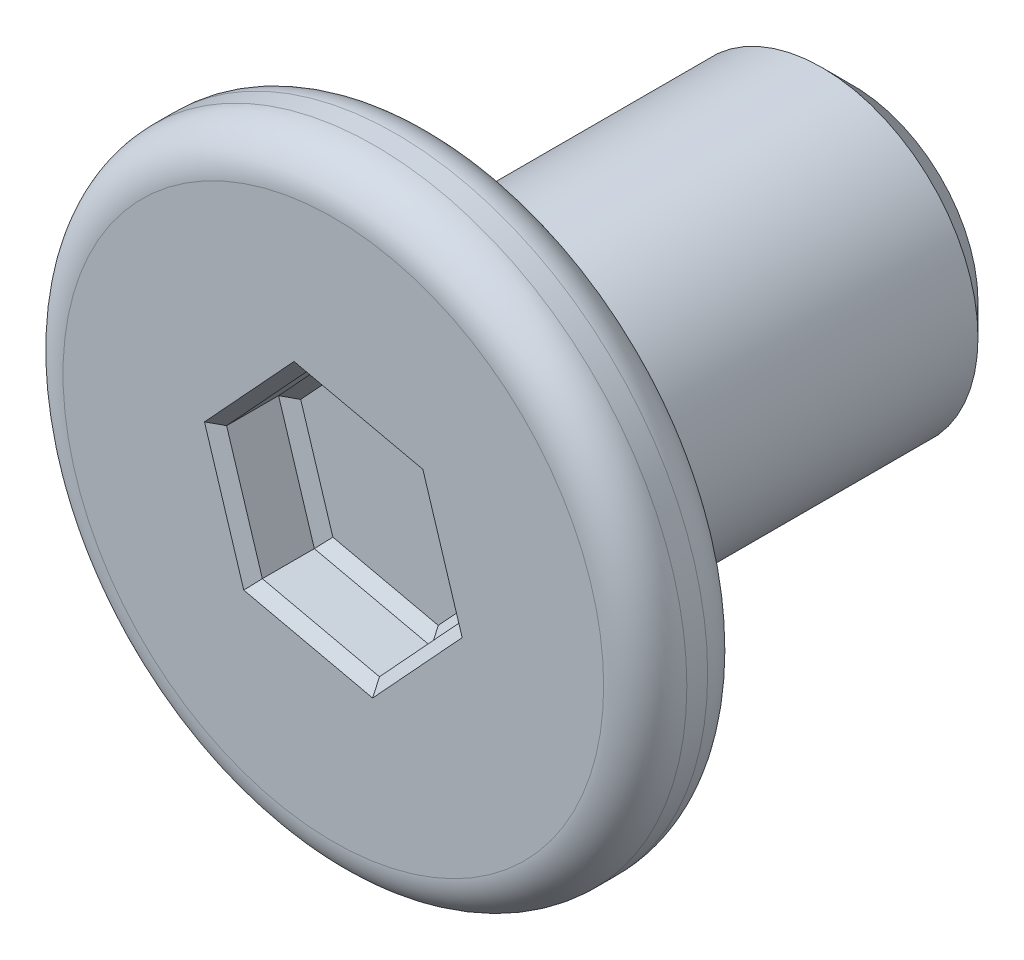
ISO-10303-21;
HEADER;
FILE_DESCRIPTION(('STEP AP214'),'2;1');
FILE_NAME('part.step','',(''),(''),'','','');
FILE_SCHEMA(('AUTOMOTIVE_DESIGN { 1 0 10303 214 1 1 1 1 }'));
ENDSEC;
DATA;
#1=APPLICATION_CONTEXT('core data for automotive mechanical design processes');
#2=APPLICATION_PROTOCOL_DEFINITION('international standard','automotive_design',2000,#1);
#3=PRODUCT_CONTEXT('',#1,'mechanical');
#4=PRODUCT('Part','Part','',(#3));
#5=PRODUCT_RELATED_PRODUCT_CATEGORY('part','',(#4));
#6=PRODUCT_DEFINITION_FORMATION('','',#4);
#7=PRODUCT_DEFINITION_CONTEXT('part definition',#1,'design');
#8=PRODUCT_DEFINITION('design','',#6,#7);
#9=PRODUCT_DEFINITION_SHAPE('','',#8);
#10=(LENGTH_UNIT() NAMED_UNIT(*) SI_UNIT(.MILLI.,.METRE.));
#11=(NAMED_UNIT(*) PLANE_ANGLE_UNIT() SI_UNIT($,.RADIAN.));
#12=(NAMED_UNIT(*) SI_UNIT($,.STERADIAN.) SOLID_ANGLE_UNIT());
#13=UNCERTAINTY_MEASURE_WITH_UNIT(LENGTH_MEASURE(1.E-05),#10,'distance_accuracy_value','');
#14=(GEOMETRIC_REPRESENTATION_CONTEXT(3) GLOBAL_UNCERTAINTY_ASSIGNED_CONTEXT((#13)) GLOBAL_UNIT_ASSIGNED_CONTEXT((#10,
#11,#12)) REPRESENTATION_CONTEXT('',''));
#15=CARTESIAN_POINT('',(0.,0.,0.));
#16=DIRECTION('',(0.,0.,1.));
#17=DIRECTION('',(1.,0.,0.));
#18=AXIS2_PLACEMENT_3D('',#15,#16,#17);
#19=CARTESIAN_POINT('',(0.,0.,1.));
#20=DIRECTION('',(0.,0.,-1.));
#21=DIRECTION('',(-1.,0.,0.));
#22=AXIS2_PLACEMENT_3D('',#19,#20,#21);
#23=CYLINDRICAL_SURFACE('',#22,3.);
#24=CARTESIAN_POINT('',(0.,0.,0.4));
#25=DIRECTION('',(0.,0.,1.));
#26=DIRECTION('',(1.,0.,0.));
#27=AXIS2_PLACEMENT_3D('',#24,#25,#26);
#28=CIRCLE('',#27,3.);
#29=CARTESIAN_POINT('',(3.,0.,0.4));
#30=VERTEX_POINT('',#29);
#31=EDGE_CURVE('E284',#30,#30,#28,.T.);
#32=ORIENTED_EDGE('',*,*,#31,.T.);
#33=EDGE_LOOP('',(#32));
#34=FACE_BOUND('',#33,.T.);
#35=CARTESIAN_POINT('',(0.,0.,0.6));
#36=DIRECTION('',(0.,0.,1.));
#37=DIRECTION('',(1.,0.,0.));
#38=AXIS2_PLACEMENT_3D('',#35,#36,#37);
#39=CIRCLE('',#38,3.);
#40=CARTESIAN_POINT('',(3.,0.,0.6));
#41=VERTEX_POINT('',#40);
#42=EDGE_CURVE('E281',#41,#41,#39,.F.);
#43=ORIENTED_EDGE('',*,*,#42,.T.);
#44=EDGE_LOOP('',(#43));
#45=FACE_BOUND('',#44,.T.);
#46=ADVANCED_FACE('F36',(#34,#45),#23,.T.);
#47=CARTESIAN_POINT('',(0.,0.,1.));
#48=DIRECTION('',(0.,0.,1.));
#49=DIRECTION('',(1.,0.,0.));
#50=AXIS2_PLACEMENT_3D('',#47,#48,#49);
#51=PLANE('',#50);
#52=DIRECTION('',(-0.67799733144157,-0.735064363547921,0.));
#53=VECTOR('',#52,1.);
#54=CARTESIAN_POINT('',(0.417128858085074,-1.17018667275182,1.));
#55=LINE('',#54,#53);
#56=CARTESIAN_POINT('',(1.23915693590211,-0.278968495603025,1.));
#57=VERTEX_POINT('',#56);
#58=CARTESIAN_POINT('',(0.37798466390331,-1.21262563356843,1.));
#59=VERTEX_POINT('',#58);
#60=EDGE_CURVE('E220',#57,#59,#55,.T.);
#61=ORIENTED_EDGE('',*,*,#60,.T.);
#62=DIRECTION('',(-0.975583077969925,0.219630730952497,0.));
#63=VECTOR('',#62,1.);
#64=CARTESIAN_POINT('',(-0.804846956730526,-0.946337524129178,1.));
#65=LINE('',#64,#63);
#66=CARTESIAN_POINT('',(-0.861172271998804,-0.933657137965404,1.));
#67=VERTEX_POINT('',#66);
#68=EDGE_CURVE('E225',#59,#67,#65,.T.);
#69=ORIENTED_EDGE('',*,*,#68,.T.);
#70=DIRECTION('',(-0.297585746528355,0.954695094500418,0.));
#71=VECTOR('',#70,1.);
#72=CARTESIAN_POINT('',(-1.2219758148156,0.223849148622641,1.));
#73=LINE('',#72,#71);
#74=CARTESIAN_POINT('',(-1.23915693590211,0.278968495603024,1.));
#75=VERTEX_POINT('',#74);
#76=EDGE_CURVE('E218',#67,#75,#73,.T.);
#77=ORIENTED_EDGE('',*,*,#76,.T.);
#78=DIRECTION('',(0.67799733144157,0.735064363547921,0.));
#79=VECTOR('',#78,1.);
#80=CARTESIAN_POINT('',(-0.417128858085074,1.17018667275182,1.));
#81=LINE('',#80,#79);
#82=CARTESIAN_POINT('',(-0.377984663903311,1.21262563356843,1.));
#83=VERTEX_POINT('',#82);
#84=EDGE_CURVE('E207',#75,#83,#81,.T.);
#85=ORIENTED_EDGE('',*,*,#84,.T.);
#86=DIRECTION('',(0.975583077969925,-0.219630730952497,0.));
#87=VECTOR('',#86,1.);
#88=CARTESIAN_POINT('',(0.804846956730525,0.946337524129178,1.));
#89=LINE('',#88,#87);
#90=CARTESIAN_POINT('',(0.861172271998803,0.933657137965404,1.));
#91=VERTEX_POINT('',#90);
#92=EDGE_CURVE('E214',#83,#91,#89,.T.);
#93=ORIENTED_EDGE('',*,*,#92,.T.);
#94=DIRECTION('',(0.297585746528355,-0.954695094500418,0.));
#95=VECTOR('',#94,1.);
#96=CARTESIAN_POINT('',(1.2219758148156,-0.223849148622642,1.));
#97=LINE('',#96,#95);
#98=EDGE_CURVE('E216',#91,#57,#97,.T.);
#99=ORIENTED_EDGE('',*,*,#98,.T.);
#100=EDGE_LOOP('',(#61,#69,#77,#85,#93,#99));
#101=FACE_BOUND('',#100,.T.);
#102=CARTESIAN_POINT('',(0.,0.,1.));
#103=DIRECTION('',(0.,0.,1.));
#104=DIRECTION('',(1.,0.,0.));
#105=AXIS2_PLACEMENT_3D('',#102,#103,#104);
#106=CIRCLE('',#105,2.6);
#107=CARTESIAN_POINT('',(2.6,0.,1.));
#108=VERTEX_POINT('',#107);
#109=EDGE_CURVE('E158',#108,#108,#106,.T.);
#110=ORIENTED_EDGE('',*,*,#109,.T.);
#111=EDGE_LOOP('',(#110));
#112=FACE_BOUND('',#111,.T.);
#113=ADVANCED_FACE('F294',(#101,#112),#51,.T.);
#114=CARTESIAN_POINT('',(0.,0.,0.));
#115=DIRECTION('',(0.,0.,1.));
#116=DIRECTION('',(1.,0.,0.));
#117=AXIS2_PLACEMENT_3D('',#114,#115,#116);
#118=PLANE('',#117);
#119=CARTESIAN_POINT('',(0.,0.,0.));
#120=DIRECTION('',(0.,0.,1.));
#121=DIRECTION('',(1.,0.,0.));
#122=AXIS2_PLACEMENT_3D('',#119,#120,#121);
#123=CIRCLE('',#122,2.6);
#124=CARTESIAN_POINT('',(2.6,0.,0.));
#125=VERTEX_POINT('',#124);
#126=EDGE_CURVE('E287',#125,#125,#123,.F.);
#127=ORIENTED_EDGE('',*,*,#126,.T.);
#128=EDGE_LOOP('',(#127));
#129=FACE_BOUND('',#128,.T.);
#130=CARTESIAN_POINT('',(0.,0.,0.));
#131=DIRECTION('',(0.,0.,-1.));
#132=DIRECTION('',(-1.,0.,0.));
#133=AXIS2_PLACEMENT_3D('',#130,#131,#132);
#134=CIRCLE('',#133,1.5);
#135=CARTESIAN_POINT('',(-1.5,0.,0.));
#136=VERTEX_POINT('',#135);
#137=EDGE_CURVE('E271',#136,#136,#134,.T.);
#138=ORIENTED_EDGE('',*,*,#137,.F.);
#139=EDGE_LOOP('',(#138));
#140=FACE_BOUND('',#139,.T.);
#141=ADVANCED_FACE('F326',(#129,#140),#118,.F.);
#142=CARTESIAN_POINT('',(0.,0.,-4.));
#143=DIRECTION('',(0.,0.,1.));
#144=DIRECTION('',(1.,0.,0.));
#145=AXIS2_PLACEMENT_3D('',#142,#143,#144);
#146=CYLINDRICAL_SURFACE('',#145,1.5);
#147=CARTESIAN_POINT('',(0.,0.,-3.7));
#148=DIRECTION('',(0.,0.,-1.));
#149=DIRECTION('',(-1.,0.,0.));
#150=AXIS2_PLACEMENT_3D('',#147,#148,#149);
#151=CIRCLE('',#150,1.5);
#152=CARTESIAN_POINT('',(-1.5,0.,-3.7));
#153=VERTEX_POINT('',#152);
#154=EDGE_CURVE('E11',#153,#153,#151,.F.);
#155=ORIENTED_EDGE('',*,*,#154,.T.);
#156=EDGE_LOOP('',(#155));
#157=FACE_BOUND('',#156,.T.);
#158=ORIENTED_EDGE('',*,*,#137,.T.);
#159=EDGE_LOOP('',(#158));
#160=FACE_BOUND('',#159,.T.);
#161=ADVANCED_FACE('F403',(#157,#160),#146,.T.);
#162=CARTESIAN_POINT('',(0.,0.,-4.));
#163=DIRECTION('',(0.,0.,-1.));
#164=DIRECTION('',(-1.,0.,0.));
#165=AXIS2_PLACEMENT_3D('',#162,#163,#164);
#166=PLANE('',#165);
#167=CARTESIAN_POINT('',(0.,0.,-4.));
#168=DIRECTION('',(0.,0.,-1.));
#169=DIRECTION('',(-1.,0.,0.));
#170=AXIS2_PLACEMENT_3D('',#167,#168,#169);
#171=CIRCLE('',#170,1.2);
#172=CARTESIAN_POINT('',(-1.2,0.,-4.));
#173=VERTEX_POINT('',#172);
#174=EDGE_CURVE('E44',#173,#173,#171,.T.);
#175=ORIENTED_EDGE('',*,*,#174,.T.);
#176=EDGE_LOOP('',(#175));
#177=FACE_BOUND('',#176,.T.);
#178=ADVANCED_FACE('F335',(#177),#166,.T.);
#179=CARTESIAN_POINT('',(0.,0.,0.4));
#180=DIRECTION('',(0.,0.,1.));
#181=DIRECTION('',(1.,0.,0.));
#182=AXIS2_PLACEMENT_3D('',#179,#180,#181);
#183=TOROIDAL_SURFACE('',#182,2.6,0.4);
#184=ORIENTED_EDGE('',*,*,#126,.F.);
#185=EDGE_LOOP('',(#184));
#186=FACE_BOUND('',#185,.T.);
#187=ORIENTED_EDGE('',*,*,#31,.F.);
#188=EDGE_LOOP('',(#187));
#189=FACE_BOUND('',#188,.T.);
#190=ADVANCED_FACE('F331',(#186,#189),#183,.T.);
#191=CARTESIAN_POINT('',(0.,0.,0.6));
#192=DIRECTION('',(0.,0.,1.));
#193=DIRECTION('',(1.,0.,0.));
#194=AXIS2_PLACEMENT_3D('',#191,#192,#193);
#195=TOROIDAL_SURFACE('',#194,2.6,0.4);
#196=ORIENTED_EDGE('',*,*,#42,.F.);
#197=EDGE_LOOP('',(#196));
#198=FACE_BOUND('',#197,.T.);
#199=ORIENTED_EDGE('',*,*,#109,.F.);
#200=EDGE_LOOP('',(#199));
#201=FACE_BOUND('',#200,.T.);
#202=ADVANCED_FACE('F334',(#198,#201),#195,.T.);
#203=CARTESIAN_POINT('',(-0.782883883635277,-0.848779216332186,0.3));
#204=DIRECTION('',(-0.219630730952497,-0.975583077969925,0.));
#205=DIRECTION('',(0.975583077969925,-0.219630730952497,0.));
#206=AXIS2_PLACEMENT_3D('',#203,#204,#205);
#207=PLANE('',#206);
#208=DIRECTION('',(0.,0.,1.));
#209=VECTOR('',#208,1.);
#210=CARTESIAN_POINT('',(-0.782883883635277,-0.848779216332186,0.3));
#211=LINE('',#210,#209);
#212=CARTESIAN_POINT('',(-0.782883883635277,-0.848779216332186,0.4));
#213=VERTEX_POINT('',#212);
#214=CARTESIAN_POINT('',(-0.782883883635277,-0.848779216332186,0.900000000000001));
#215=VERTEX_POINT('',#214);
#216=EDGE_CURVE('E264',#213,#215,#211,.T.);
#217=ORIENTED_EDGE('',*,*,#216,.T.);
#218=DIRECTION('',(0.975583077969925,-0.219630730952497,0.));
#219=VECTOR('',#218,1.);
#220=CARTESIAN_POINT('',(0.343622421730282,-1.10238693960766,0.900000000000001));
#221=LINE('',#220,#219);
#222=CARTESIAN_POINT('',(0.343622421730282,-1.10238693960766,0.900000000000001));
#223=VERTEX_POINT('',#222);
#224=EDGE_CURVE('E148',#215,#223,#221,.T.);
#225=ORIENTED_EDGE('',*,*,#224,.T.);
#226=DIRECTION('',(0.,0.,1.));
#227=VECTOR('',#226,1.);
#228=CARTESIAN_POINT('',(0.343622421730282,-1.10238693960766,0.3));
#229=LINE('',#228,#227);
#230=CARTESIAN_POINT('',(0.343622421730282,-1.10238693960766,0.4));
#231=VERTEX_POINT('',#230);
#232=EDGE_CURVE('E129',#231,#223,#229,.T.);
#233=ORIENTED_EDGE('',*,*,#232,.F.);
#234=DIRECTION('',(-0.975583077969925,0.219630730952497,0.));
#235=VECTOR('',#234,1.);
#236=CARTESIAN_POINT('',(-0.782883883635277,-0.848779216332186,0.4));
#237=LINE('',#236,#235);
#238=EDGE_CURVE('E145',#231,#213,#237,.T.);
#239=ORIENTED_EDGE('',*,*,#238,.T.);
#240=EDGE_LOOP('',(#217,#225,#233,#239));
#241=FACE_BOUND('',#240,.T.);
#242=ADVANCED_FACE('F144',(#241),#207,.F.);
#243=CARTESIAN_POINT('',(-1.12650630536556,0.253607723275477,0.3));
#244=DIRECTION('',(-0.954695094500418,-0.297585746528355,0.));
#245=DIRECTION('',(0.297585746528355,-0.954695094500418,0.));
#246=AXIS2_PLACEMENT_3D('',#243,#244,#245);
#247=PLANE('',#246);
#248=DIRECTION('',(0.,0.,1.));
#249=VECTOR('',#248,1.);
#250=CARTESIAN_POINT('',(-1.12650630536556,0.253607723275477,0.3));
#251=LINE('',#250,#249);
#252=CARTESIAN_POINT('',(-1.12650630536556,0.253607723275477,0.4));
#253=VERTEX_POINT('',#252);
#254=CARTESIAN_POINT('',(-1.12650630536556,0.253607723275477,0.900000000000001));
#255=VERTEX_POINT('',#254);
#256=EDGE_CURVE('E263',#253,#255,#251,.T.);
#257=ORIENTED_EDGE('',*,*,#256,.T.);
#258=DIRECTION('',(0.297585746528355,-0.954695094500418,0.));
#259=VECTOR('',#258,1.);
#260=CARTESIAN_POINT('',(-0.782883883635277,-0.848779216332186,0.900000000000001));
#261=LINE('',#260,#259);
#262=EDGE_CURVE('E230',#255,#215,#261,.T.);
#263=ORIENTED_EDGE('',*,*,#262,.T.);
#264=ORIENTED_EDGE('',*,*,#216,.F.);
#265=DIRECTION('',(-0.297585746528355,0.954695094500418,0.));
#266=VECTOR('',#265,1.);
#267=CARTESIAN_POINT('',(-1.12650630536556,0.253607723275477,0.4));
#268=LINE('',#267,#266);
#269=EDGE_CURVE('E228',#213,#253,#268,.T.);
#270=ORIENTED_EDGE('',*,*,#269,.T.);
#271=EDGE_LOOP('',(#257,#263,#264,#270));
#272=FACE_BOUND('',#271,.T.);
#273=ADVANCED_FACE('F262',(#272),#247,.F.);
#274=CARTESIAN_POINT('',(-0.343622421730283,1.10238693960766,0.3));
#275=DIRECTION('',(-0.735064363547921,0.67799733144157,0.));
#276=DIRECTION('',(-0.67799733144157,-0.735064363547921,0.));
#277=AXIS2_PLACEMENT_3D('',#274,#275,#276);
#278=PLANE('',#277);
#279=DIRECTION('',(0.,0.,1.));
#280=VECTOR('',#279,1.);
#281=CARTESIAN_POINT('',(-0.343622421730283,1.10238693960766,0.3));
#282=LINE('',#281,#280);
#283=CARTESIAN_POINT('',(-0.343622421730283,1.10238693960766,0.4));
#284=VERTEX_POINT('',#283);
#285=CARTESIAN_POINT('',(-0.343622421730283,1.10238693960766,0.900000000000001));
#286=VERTEX_POINT('',#285);
#287=EDGE_CURVE('E269',#284,#286,#282,.T.);
#288=ORIENTED_EDGE('',*,*,#287,.T.);
#289=DIRECTION('',(-0.67799733144157,-0.735064363547921,0.));
#290=VECTOR('',#289,1.);
#291=CARTESIAN_POINT('',(-1.12650630536556,0.253607723275477,0.900000000000001));
#292=LINE('',#291,#290);
#293=EDGE_CURVE('E208',#286,#255,#292,.T.);
#294=ORIENTED_EDGE('',*,*,#293,.T.);
#295=ORIENTED_EDGE('',*,*,#256,.F.);
#296=DIRECTION('',(0.67799733144157,0.735064363547921,0.));
#297=VECTOR('',#296,1.);
#298=CARTESIAN_POINT('',(-0.343622421730283,1.10238693960766,0.4));
#299=LINE('',#298,#297);
#300=EDGE_CURVE('E232',#253,#284,#299,.T.);
#301=ORIENTED_EDGE('',*,*,#300,.T.);
#302=EDGE_LOOP('',(#288,#294,#295,#301));
#303=FACE_BOUND('',#302,.T.);
#304=ADVANCED_FACE('F267',(#303),#278,.F.);
#305=CARTESIAN_POINT('',(0.782883883635276,0.848779216332186,0.3));
#306=DIRECTION('',(0.219630730952497,0.975583077969925,0.));
#307=DIRECTION('',(-0.975583077969925,0.219630730952497,0.));
#308=AXIS2_PLACEMENT_3D('',#305,#306,#307);
#309=PLANE('',#308);
#310=DIRECTION('',(0.,0.,1.));
#311=VECTOR('',#310,1.);
#312=CARTESIAN_POINT('',(0.782883883635276,0.848779216332186,0.3));
#313=LINE('',#312,#311);
#314=CARTESIAN_POINT('',(0.782883883635276,0.848779216332186,0.4));
#315=VERTEX_POINT('',#314);
#316=CARTESIAN_POINT('',(0.782883883635276,0.848779216332186,0.9));
#317=VERTEX_POINT('',#316);
#318=EDGE_CURVE('E273',#315,#317,#313,.T.);
#319=ORIENTED_EDGE('',*,*,#318,.T.);
#320=DIRECTION('',(-0.975583077969925,0.219630730952497,0.));
#321=VECTOR('',#320,1.);
#322=CARTESIAN_POINT('',(-0.343622421730283,1.10238693960766,0.900000000000001));
#323=LINE('',#322,#321);
#324=EDGE_CURVE('E213',#317,#286,#323,.T.);
#325=ORIENTED_EDGE('',*,*,#324,.T.);
#326=ORIENTED_EDGE('',*,*,#287,.F.);
#327=DIRECTION('',(0.975583077969925,-0.219630730952497,0.));
#328=VECTOR('',#327,1.);
#329=CARTESIAN_POINT('',(0.782883883635276,0.848779216332186,0.4));
#330=LINE('',#329,#328);
#331=EDGE_CURVE('E235',#284,#315,#330,.T.);
#332=ORIENTED_EDGE('',*,*,#331,.T.);
#333=EDGE_LOOP('',(#319,#325,#326,#332));
#334=FACE_BOUND('',#333,.T.);
#335=ADVANCED_FACE('F455',(#334),#309,.F.);
#336=CARTESIAN_POINT('',(1.12650630536556,-0.253607723275477,0.3));
#337=DIRECTION('',(0.954695094500418,0.297585746528355,0.));
#338=DIRECTION('',(-0.297585746528355,0.954695094500418,0.));
#339=AXIS2_PLACEMENT_3D('',#336,#337,#338);
#340=PLANE('',#339);
#341=DIRECTION('',(0.,0.,1.));
#342=VECTOR('',#341,1.);
#343=CARTESIAN_POINT('',(1.12650630536556,-0.253607723275477,0.3));
#344=LINE('',#343,#342);
#345=CARTESIAN_POINT('',(1.12650630536556,-0.253607723275477,0.4));
#346=VERTEX_POINT('',#345);
#347=CARTESIAN_POINT('',(1.12650630536556,-0.253607723275477,0.900000000000001));
#348=VERTEX_POINT('',#347);
#349=EDGE_CURVE('E131',#346,#348,#344,.T.);
#350=ORIENTED_EDGE('',*,*,#349,.T.);
#351=DIRECTION('',(-0.297585746528355,0.954695094500418,0.));
#352=VECTOR('',#351,1.);
#353=CARTESIAN_POINT('',(0.782883883635276,0.848779216332186,0.9));
#354=LINE('',#353,#352);
#355=EDGE_CURVE('E137',#348,#317,#354,.T.);
#356=ORIENTED_EDGE('',*,*,#355,.T.);
#357=ORIENTED_EDGE('',*,*,#318,.F.);
#358=DIRECTION('',(0.297585746528355,-0.954695094500418,0.));
#359=VECTOR('',#358,1.);
#360=CARTESIAN_POINT('',(1.12650630536556,-0.253607723275477,0.4));
#361=LINE('',#360,#359);
#362=EDGE_CURVE('E238',#315,#346,#361,.T.);
#363=ORIENTED_EDGE('',*,*,#362,.T.);
#364=EDGE_LOOP('',(#350,#356,#357,#363));
#365=FACE_BOUND('',#364,.T.);
#366=ADVANCED_FACE('F306',(#365),#340,.F.);
#367=CARTESIAN_POINT('',(0.343622421730282,-1.10238693960766,0.3));
#368=DIRECTION('',(0.735064363547921,-0.67799733144157,0.));
#369=DIRECTION('',(0.67799733144157,0.735064363547921,0.));
#370=AXIS2_PLACEMENT_3D('',#367,#368,#369);
#371=PLANE('',#370);
#372=ORIENTED_EDGE('',*,*,#232,.T.);
#373=DIRECTION('',(0.67799733144157,0.735064363547921,0.));
#374=VECTOR('',#373,1.);
#375=CARTESIAN_POINT('',(1.12650630536556,-0.253607723275477,0.900000000000001));
#376=LINE('',#375,#374);
#377=EDGE_CURVE('E136',#223,#348,#376,.T.);
#378=ORIENTED_EDGE('',*,*,#377,.T.);
#379=ORIENTED_EDGE('',*,*,#349,.F.);
#380=DIRECTION('',(-0.67799733144157,-0.735064363547921,0.));
#381=VECTOR('',#380,1.);
#382=CARTESIAN_POINT('',(0.343622421730282,-1.10238693960766,0.4));
#383=LINE('',#382,#381);
#384=EDGE_CURVE('E126',#346,#231,#383,.T.);
#385=ORIENTED_EDGE('',*,*,#384,.T.);
#386=EDGE_LOOP('',(#372,#378,#379,#385));
#387=FACE_BOUND('',#386,.T.);
#388=ADVANCED_FACE('F128',(#387),#371,.F.);
#389=CARTESIAN_POINT('',(0.,0.,0.3));
#390=DIRECTION('',(0.,0.,1.));
#391=DIRECTION('',(1.,0.,0.));
#392=AXIS2_PLACEMENT_3D('',#389,#390,#391);
#393=PLANE('',#392);
#394=DIRECTION('',(0.297585746528355,-0.954695094500418,0.));
#395=VECTOR('',#394,1.);
#396=CARTESIAN_POINT('',(-0.859225585050374,-0.267827171875519,0.3));
#397=LINE('',#396,#395);
#398=CARTESIAN_POINT('',(-1.013855674829,0.228246950947929,0.3));
#399=VERTEX_POINT('',#398);
#400=CARTESIAN_POINT('',(-0.704595495271748,-0.763901294698966,0.3));
#401=VERTEX_POINT('',#400);
#402=EDGE_CURVE('E51',#399,#401,#397,.T.);
#403=ORIENTED_EDGE('',*,*,#402,.T.);
#404=DIRECTION('',(0.975583077969925,-0.219630730952497,0.));
#405=VECTOR('',#404,1.);
#406=CARTESIAN_POINT('',(-0.197667657857247,-0.878024770172931,0.3));
#407=LINE('',#406,#405);
#408=CARTESIAN_POINT('',(0.309260179557253,-0.992148245646895,0.3));
#409=VERTEX_POINT('',#408);
#410=EDGE_CURVE('E179',#401,#409,#407,.T.);
#411=ORIENTED_EDGE('',*,*,#410,.T.);
#412=DIRECTION('',(0.67799733144157,0.735064363547921,0.));
#413=VECTOR('',#412,1.);
#414=CARTESIAN_POINT('',(0.661557927193127,-0.610197598297412,0.3));
#415=LINE('',#414,#413);
#416=CARTESIAN_POINT('',(1.013855674829,-0.228246950947929,0.3));
#417=VERTEX_POINT('',#416);
#418=EDGE_CURVE('E161',#409,#417,#415,.T.);
#419=ORIENTED_EDGE('',*,*,#418,.T.);
#420=DIRECTION('',(-0.297585746528355,0.954695094500418,0.));
#421=VECTOR('',#420,1.);
#422=CARTESIAN_POINT('',(0.859225585050374,0.267827171875519,0.3));
#423=LINE('',#422,#421);
#424=CARTESIAN_POINT('',(0.704595495271747,0.763901294698967,0.3));
#425=VERTEX_POINT('',#424);
#426=EDGE_CURVE('E243',#417,#425,#423,.T.);
#427=ORIENTED_EDGE('',*,*,#426,.T.);
#428=DIRECTION('',(-0.975583077969925,0.219630730952497,0.));
#429=VECTOR('',#428,1.);
#430=CARTESIAN_POINT('',(0.197667657857247,0.878024770172931,0.3));
#431=LINE('',#430,#429);
#432=CARTESIAN_POINT('',(-0.309260179557254,0.992148245646895,0.3));
#433=VERTEX_POINT('',#432);
#434=EDGE_CURVE('E245',#425,#433,#431,.T.);
#435=ORIENTED_EDGE('',*,*,#434,.T.);
#436=DIRECTION('',(-0.67799733144157,-0.735064363547921,0.));
#437=VECTOR('',#436,1.);
#438=CARTESIAN_POINT('',(-0.661557927193128,0.610197598297412,0.3));
#439=LINE('',#438,#437);
#440=EDGE_CURVE('E56',#433,#399,#439,.T.);
#441=ORIENTED_EDGE('',*,*,#440,.T.);
#442=EDGE_LOOP('',(#403,#411,#419,#427,#435,#441));
#443=FACE_BOUND('',#442,.T.);
#444=ADVANCED_FACE('F248',(#443),#393,.T.);
#445=CARTESIAN_POINT('',(0.782883883635276,0.848779216332186,0.900000000000001));
#446=DIRECTION('',(-0.155302379213469,-0.689841410043379,0.707106781186546));
#447=DIRECTION('',(0.975583077969925,-0.219630730952497,0.));
#448=AXIS2_PLACEMENT_3D('',#445,#446,#447);
#449=PLANE('',#448);
#450=DIRECTION('',(-0.512517808159949,-0.555656429592506,-0.654653670707979));
#451=VECTOR('',#450,1.);
#452=CARTESIAN_POINT('',(0.782883883635276,0.848779216332186,0.900000000000001));
#453=LINE('',#452,#451);
#454=EDGE_CURVE('E194',#91,#317,#453,.T.);
#455=ORIENTED_EDGE('',*,*,#454,.F.);
#456=ORIENTED_EDGE('',*,*,#92,.F.);
#457=DIRECTION('',(0.224953679723294,-0.721681656554689,-0.654653670707978));
#458=VECTOR('',#457,1.);
#459=CARTESIAN_POINT('',(-0.343622421730283,1.10238693960766,0.900000000000001));
#460=LINE('',#459,#458);
#461=EDGE_CURVE('E149',#286,#83,#460,.F.);
#462=ORIENTED_EDGE('',*,*,#461,.F.);
#463=ORIENTED_EDGE('',*,*,#324,.F.);
#464=EDGE_LOOP('',(#455,#456,#462,#463));
#465=FACE_BOUND('',#464,.T.);
#466=ADVANCED_FACE('F212',(#465),#449,.T.);
#467=CARTESIAN_POINT('',(-0.343622421730283,1.10238693960766,0.900000000000001));
#468=DIRECTION('',(0.519768996073309,-0.479416510688718,0.707106781186546));
#469=DIRECTION('',(0.67799733144157,0.735064363547921,0.));
#470=AXIS2_PLACEMENT_3D('',#467,#468,#469);
#471=PLANE('',#470);
#472=ORIENTED_EDGE('',*,*,#461,.T.);
#473=ORIENTED_EDGE('',*,*,#84,.F.);
#474=DIRECTION('',(0.737471487883244,-0.166025226962183,-0.654653670707978));
#475=VECTOR('',#474,1.);
#476=CARTESIAN_POINT('',(-1.12650630536556,0.253607723275477,0.900000000000001));
#477=LINE('',#476,#475);
#478=EDGE_CURVE('E192',#255,#75,#477,.F.);
#479=ORIENTED_EDGE('',*,*,#478,.F.);
#480=ORIENTED_EDGE('',*,*,#293,.F.);
#481=EDGE_LOOP('',(#472,#473,#479,#480));
#482=FACE_BOUND('',#481,.T.);
#483=ADVANCED_FACE('F205',(#482),#471,.T.);
#484=CARTESIAN_POINT('',(1.12650630536556,-0.253607723275477,0.900000000000001));
#485=DIRECTION('',(-0.675071375286779,-0.210424899354661,0.707106781186546));
#486=DIRECTION('',(0.297585746528355,-0.954695094500418,0.));
#487=AXIS2_PLACEMENT_3D('',#484,#485,#486);
#488=PLANE('',#487);
#489=ORIENTED_EDGE('',*,*,#454,.T.);
#490=ORIENTED_EDGE('',*,*,#355,.F.);
#491=DIRECTION('',(-0.737471487883243,0.166025226962185,-0.654653670707979));
#492=VECTOR('',#491,1.);
#493=CARTESIAN_POINT('',(1.12650630536556,-0.253607723275477,0.900000000000001));
#494=LINE('',#493,#492);
#495=EDGE_CURVE('E189',#57,#348,#494,.T.);
#496=ORIENTED_EDGE('',*,*,#495,.F.);
#497=ORIENTED_EDGE('',*,*,#98,.F.);
#498=EDGE_LOOP('',(#489,#490,#496,#497));
#499=FACE_BOUND('',#498,.T.);
#500=ADVANCED_FACE('F309',(#499),#488,.T.);
#501=CARTESIAN_POINT('',(-1.12650630536556,0.253607723275477,0.900000000000001));
#502=DIRECTION('',(0.675071375286778,0.210424899354661,0.707106781186547));
#503=DIRECTION('',(-0.297585746528355,0.954695094500418,0.));
#504=AXIS2_PLACEMENT_3D('',#501,#502,#503);
#505=PLANE('',#504);
#506=ORIENTED_EDGE('',*,*,#478,.T.);
#507=ORIENTED_EDGE('',*,*,#76,.F.);
#508=DIRECTION('',(0.512517808159951,0.555656429592505,-0.654653670707978));
#509=VECTOR('',#508,1.);
#510=CARTESIAN_POINT('',(-0.782883883635277,-0.848779216332186,0.900000000000001));
#511=LINE('',#510,#509);
#512=EDGE_CURVE('E187',#215,#67,#511,.F.);
#513=ORIENTED_EDGE('',*,*,#512,.F.);
#514=ORIENTED_EDGE('',*,*,#262,.F.);
#515=EDGE_LOOP('',(#506,#507,#513,#514));
#516=FACE_BOUND('',#515,.T.);
#517=ADVANCED_FACE('F311',(#516),#505,.T.);
#518=CARTESIAN_POINT('',(0.343622421730282,-1.10238693960766,0.900000000000001));
#519=DIRECTION('',(-0.519768996073309,0.479416510688718,0.707106781186547));
#520=DIRECTION('',(-0.67799733144157,-0.735064363547921,0.));
#521=AXIS2_PLACEMENT_3D('',#518,#519,#520);
#522=PLANE('',#521);
#523=ORIENTED_EDGE('',*,*,#495,.T.);
#524=ORIENTED_EDGE('',*,*,#377,.F.);
#525=DIRECTION('',(0.224953679723294,-0.721681656554689,0.654653670707978));
#526=VECTOR('',#525,1.);
#527=CARTESIAN_POINT('',(0.245444586950202,-0.787419242576903,0.614285714285715));
#528=LINE('',#527,#526);
#529=EDGE_CURVE('E177',#59,#223,#528,.F.);
#530=ORIENTED_EDGE('',*,*,#529,.F.);
#531=ORIENTED_EDGE('',*,*,#60,.F.);
#532=EDGE_LOOP('',(#523,#524,#530,#531));
#533=FACE_BOUND('',#532,.T.);
#534=ADVANCED_FACE('F304',(#533),#522,.T.);
#535=CARTESIAN_POINT('',(-0.782883883635277,-0.848779216332186,0.900000000000001));
#536=DIRECTION('',(0.155302379213469,0.689841410043379,0.707106781186547));
#537=DIRECTION('',(-0.975583077969925,0.219630730952497,0.));
#538=AXIS2_PLACEMENT_3D('',#535,#536,#537);
#539=PLANE('',#538);
#540=ORIENTED_EDGE('',*,*,#512,.T.);
#541=ORIENTED_EDGE('',*,*,#68,.F.);
#542=ORIENTED_EDGE('',*,*,#529,.T.);
#543=ORIENTED_EDGE('',*,*,#224,.F.);
#544=EDGE_LOOP('',(#540,#541,#542,#543));
#545=FACE_BOUND('',#544,.T.);
#546=ADVANCED_FACE('F300',(#545),#539,.T.);
#547=CARTESIAN_POINT('',(0.197667657857247,0.878024770172931,0.3));
#548=DIRECTION('',(0.155302379213468,0.689841410043374,-0.707106781186552));
#549=DIRECTION('',(-0.975583077969925,0.219630730952497,0.));
#550=AXIS2_PLACEMENT_3D('',#547,#548,#549);
#551=PLANE('',#550);
#552=DIRECTION('',(-0.512517808159954,-0.555656429592508,-0.654653670707973));
#553=VECTOR('',#552,1.);
#554=CARTESIAN_POINT('',(0.60393899594721,0.654772538313399,0.171428571428572));
#555=LINE('',#554,#553);
#556=EDGE_CURVE('E172',#315,#425,#555,.T.);
#557=ORIENTED_EDGE('',*,*,#556,.F.);
#558=ORIENTED_EDGE('',*,*,#331,.F.);
#559=DIRECTION('',(0.224953679723297,-0.721681656554693,-0.654653670707972));
#560=VECTOR('',#559,1.);
#561=CARTESIAN_POINT('',(-0.265080153906217,0.850412781983052,0.171428571428572));
#562=LINE('',#561,#560);
#563=EDGE_CURVE('E175',#433,#284,#562,.F.);
#564=ORIENTED_EDGE('',*,*,#563,.F.);
#565=ORIENTED_EDGE('',*,*,#434,.F.);
#566=EDGE_LOOP('',(#557,#558,#564,#565));
#567=FACE_BOUND('',#566,.T.);
#568=ADVANCED_FACE('F253',(#567),#551,.F.);
#569=CARTESIAN_POINT('',(-0.661557927193128,0.610197598297412,0.3));
#570=DIRECTION('',(-0.519768996073305,0.479416510688714,-0.707106781186552));
#571=DIRECTION('',(-0.67799733144157,-0.735064363547921,0.));
#572=AXIS2_PLACEMENT_3D('',#569,#570,#571);
#573=PLANE('',#572);
#574=ORIENTED_EDGE('',*,*,#563,.T.);
#575=ORIENTED_EDGE('',*,*,#300,.F.);
#576=DIRECTION('',(0.737471487883249,-0.166025226962184,-0.654653670707972));
#577=VECTOR('',#576,1.);
#578=CARTESIAN_POINT('',(-0.869019149853428,0.195640243669653,0.171428571428572));
#579=LINE('',#578,#577);
#580=EDGE_CURVE('E169',#399,#253,#579,.F.);
#581=ORIENTED_EDGE('',*,*,#580,.F.);
#582=ORIENTED_EDGE('',*,*,#440,.F.);
#583=EDGE_LOOP('',(#574,#575,#581,#582));
#584=FACE_BOUND('',#583,.T.);
#585=ADVANCED_FACE('F256',(#584),#573,.F.);
#586=CARTESIAN_POINT('',(0.859225585050374,0.267827171875519,0.3));
#587=DIRECTION('',(0.675071375286773,0.210424899354659,-0.707106781186552));
#588=DIRECTION('',(-0.297585746528355,0.954695094500418,0.));
#589=AXIS2_PLACEMENT_3D('',#586,#587,#588);
#590=PLANE('',#589);
#591=ORIENTED_EDGE('',*,*,#556,.T.);
#592=ORIENTED_EDGE('',*,*,#426,.F.);
#593=DIRECTION('',(-0.737471487883249,0.166025226962186,-0.654653670707972));
#594=VECTOR('',#593,1.);
#595=CARTESIAN_POINT('',(0.869019149853427,-0.195640243669653,0.171428571428572));
#596=LINE('',#595,#594);
#597=EDGE_CURVE('E163',#346,#417,#596,.T.);
#598=ORIENTED_EDGE('',*,*,#597,.F.);
#599=ORIENTED_EDGE('',*,*,#362,.F.);
#600=EDGE_LOOP('',(#591,#592,#598,#599));
#601=FACE_BOUND('',#600,.T.);
#602=ADVANCED_FACE('F362',(#601),#590,.F.);
#603=CARTESIAN_POINT('',(-0.859225585050374,-0.267827171875519,0.3));
#604=DIRECTION('',(-0.675071375286772,-0.210424899354659,-0.707106781186553));
#605=DIRECTION('',(0.297585746528355,-0.954695094500418,0.));
#606=AXIS2_PLACEMENT_3D('',#603,#604,#605);
#607=PLANE('',#606);
#608=ORIENTED_EDGE('',*,*,#580,.T.);
#609=ORIENTED_EDGE('',*,*,#269,.F.);
#610=DIRECTION('',(0.512517808159955,0.555656429592508,-0.654653670707972));
#611=VECTOR('',#610,1.);
#612=CARTESIAN_POINT('',(-0.60393899594721,-0.654772538313398,0.171428571428571));
#613=LINE('',#612,#611);
#614=EDGE_CURVE('E156',#401,#213,#613,.F.);
#615=ORIENTED_EDGE('',*,*,#614,.F.);
#616=ORIENTED_EDGE('',*,*,#402,.F.);
#617=EDGE_LOOP('',(#608,#609,#615,#616));
#618=FACE_BOUND('',#617,.T.);
#619=ADVANCED_FACE('F258',(#618),#607,.F.);
#620=CARTESIAN_POINT('',(0.661557927193127,-0.610197598297412,0.3));
#621=DIRECTION('',(0.519768996073305,-0.479416510688714,-0.707106781186553));
#622=DIRECTION('',(0.67799733144157,0.735064363547921,0.));
#623=AXIS2_PLACEMENT_3D('',#620,#621,#622);
#624=PLANE('',#623);
#625=ORIENTED_EDGE('',*,*,#597,.T.);
#626=ORIENTED_EDGE('',*,*,#418,.F.);
#627=DIRECTION('',(0.224953679723297,-0.721681656554693,0.654653670707972));
#628=VECTOR('',#627,1.);
#629=CARTESIAN_POINT('',(0.265080153906216,-0.850412781983051,0.171428571428572));
#630=LINE('',#629,#628);
#631=EDGE_CURVE('E154',#231,#409,#630,.F.);
#632=ORIENTED_EDGE('',*,*,#631,.F.);
#633=ORIENTED_EDGE('',*,*,#384,.F.);
#634=EDGE_LOOP('',(#625,#626,#632,#633));
#635=FACE_BOUND('',#634,.T.);
#636=ADVANCED_FACE('F160',(#635),#624,.F.);
#637=CARTESIAN_POINT('',(-0.197667657857247,-0.878024770172931,0.3));
#638=DIRECTION('',(-0.155302379213468,-0.689841410043374,-0.707106781186552));
#639=DIRECTION('',(0.975583077969925,-0.219630730952497,0.));
#640=AXIS2_PLACEMENT_3D('',#637,#638,#639);
#641=PLANE('',#640);
#642=ORIENTED_EDGE('',*,*,#614,.T.);
#643=ORIENTED_EDGE('',*,*,#238,.F.);
#644=ORIENTED_EDGE('',*,*,#631,.T.);
#645=ORIENTED_EDGE('',*,*,#410,.F.);
#646=EDGE_LOOP('',(#642,#643,#644,#645));
#647=FACE_BOUND('',#646,.T.);
#648=ADVANCED_FACE('F152',(#647),#641,.F.);
#649=CARTESIAN_POINT('',(0.,0.,-4.));
#650=DIRECTION('',(0.,0.,1.));
#651=DIRECTION('',(1.,0.,0.));
#652=AXIS2_PLACEMENT_3D('',#649,#650,#651);
#653=CONICAL_SURFACE('',#652,1.2,0.785398163397446);
#654=ORIENTED_EDGE('',*,*,#154,.F.);
#655=EDGE_LOOP('',(#654));
#656=FACE_BOUND('',#655,.T.);
#657=ORIENTED_EDGE('',*,*,#174,.F.);
#658=EDGE_LOOP('',(#657));
#659=FACE_BOUND('',#658,.T.);
#660=ADVANCED_FACE('F38',(#656,#659),#653,.T.);
#661=CLOSED_SHELL('',(#46,#113,#141,#161,#178,#190,#202,#242,#273,#304,#335,#366,#388,#444,#466,
#483,#500,#517,#534,#546,#568,#585,#602,#619,#636,#648,#660));
#662=MANIFOLD_SOLID_BREP('B2',#661);
#663=ADVANCED_BREP_SHAPE_REPRESENTATION('',(#18,#662),#14);
#664=SHAPE_DEFINITION_REPRESENTATION(#9,#663);
ENDSEC;
END-ISO-10303-21;
